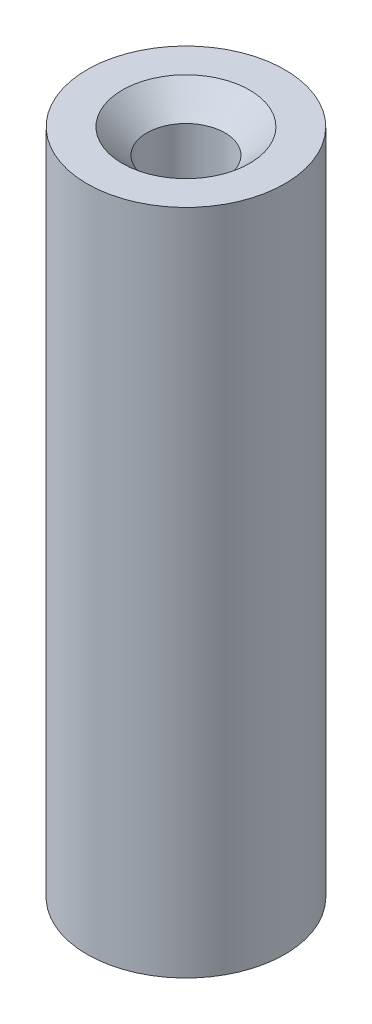
ISO-10303-21;
HEADER;
FILE_DESCRIPTION(('STEP AP214'),'2;1');
FILE_NAME('part.step','',(''),(''),'','','');
FILE_SCHEMA(('AUTOMOTIVE_DESIGN { 1 0 10303 214 1 1 1 1 }'));
ENDSEC;
DATA;
#1=APPLICATION_CONTEXT('core data for automotive mechanical design processes');
#2=APPLICATION_PROTOCOL_DEFINITION('international standard','automotive_design',2000,#1);
#3=PRODUCT_CONTEXT('',#1,'mechanical');
#4=PRODUCT('Part','Part','',(#3));
#5=PRODUCT_RELATED_PRODUCT_CATEGORY('part','',(#4));
#6=PRODUCT_DEFINITION_FORMATION('','',#4);
#7=PRODUCT_DEFINITION_CONTEXT('part definition',#1,'design');
#8=PRODUCT_DEFINITION('design','',#6,#7);
#9=PRODUCT_DEFINITION_SHAPE('','',#8);
#10=(LENGTH_UNIT() NAMED_UNIT(*) SI_UNIT(.MILLI.,.METRE.));
#11=(NAMED_UNIT(*) PLANE_ANGLE_UNIT() SI_UNIT($,.RADIAN.));
#12=(NAMED_UNIT(*) SI_UNIT($,.STERADIAN.) SOLID_ANGLE_UNIT());
#13=UNCERTAINTY_MEASURE_WITH_UNIT(LENGTH_MEASURE(1.E-05),#10,'distance_accuracy_value','');
#14=(GEOMETRIC_REPRESENTATION_CONTEXT(3) GLOBAL_UNCERTAINTY_ASSIGNED_CONTEXT((#13)) GLOBAL_UNIT_ASSIGNED_CONTEXT((#10,
#11,#12)) REPRESENTATION_CONTEXT('',''));
#15=CARTESIAN_POINT('',(0.,0.,0.));
#16=DIRECTION('',(0.,0.,1.));
#17=DIRECTION('',(1.,0.,0.));
#18=AXIS2_PLACEMENT_3D('',#15,#16,#17);
#19=CARTESIAN_POINT('',(0.,27.,0.));
#20=DIRECTION('',(0.,1.,0.));
#21=DIRECTION('',(0.,0.,1.));
#22=AXIS2_PLACEMENT_3D('',#19,#20,#21);
#23=PLANE('',#22);
#24=CARTESIAN_POINT('',(0.,27.,0.));
#25=DIRECTION('',(0.,1.,0.));
#26=DIRECTION('',(0.,0.,1.));
#27=AXIS2_PLACEMENT_3D('',#24,#25,#26);
#28=CIRCLE('',#27,2.575);
#29=CARTESIAN_POINT('',(0.,27.,2.575));
#30=VERTEX_POINT('',#29);
#31=EDGE_CURVE('E10',#30,#30,#28,.F.);
#32=ORIENTED_EDGE('',*,*,#31,.T.);
#33=EDGE_LOOP('',(#32));
#34=FACE_BOUND('',#33,.T.);
#35=CARTESIAN_POINT('',(0.,27.,0.));
#36=DIRECTION('',(0.,1.,0.));
#37=DIRECTION('',(0.,0.,1.));
#38=AXIS2_PLACEMENT_3D('',#35,#36,#37);
#39=CIRCLE('',#38,4.);
#40=CARTESIAN_POINT('',(0.,27.,4.));
#41=VERTEX_POINT('',#40);
#42=EDGE_CURVE('E62',#41,#41,#39,.T.);
#43=ORIENTED_EDGE('',*,*,#42,.T.);
#44=EDGE_LOOP('',(#43));
#45=FACE_BOUND('',#44,.T.);
#46=ADVANCED_FACE('F41',(#34,#45),#23,.T.);
#47=CARTESIAN_POINT('',(0.,0.,0.));
#48=DIRECTION('',(0.,1.,0.));
#49=DIRECTION('',(0.,0.,1.));
#50=AXIS2_PLACEMENT_3D('',#47,#48,#49);
#51=PLANE('',#50);
#52=CARTESIAN_POINT('',(0.,0.,0.));
#53=DIRECTION('',(0.,1.,0.));
#54=DIRECTION('',(0.,0.,1.));
#55=AXIS2_PLACEMENT_3D('',#52,#53,#54);
#56=CIRCLE('',#55,2.575);
#57=CARTESIAN_POINT('',(0.,0.,2.575));
#58=VERTEX_POINT('',#57);
#59=EDGE_CURVE('E60',#58,#58,#56,.T.);
#60=ORIENTED_EDGE('',*,*,#59,.T.);
#61=EDGE_LOOP('',(#60));
#62=FACE_BOUND('',#61,.T.);
#63=CARTESIAN_POINT('',(0.,0.,0.));
#64=DIRECTION('',(0.,1.,0.));
#65=DIRECTION('',(0.,0.,1.));
#66=AXIS2_PLACEMENT_3D('',#63,#64,#65);
#67=CIRCLE('',#66,4.);
#68=CARTESIAN_POINT('',(0.,0.,4.));
#69=VERTEX_POINT('',#68);
#70=EDGE_CURVE('E64',#69,#69,#67,.T.);
#71=ORIENTED_EDGE('',*,*,#70,.F.);
#72=EDGE_LOOP('',(#71));
#73=FACE_BOUND('',#72,.T.);
#74=ADVANCED_FACE('F74',(#62,#73),#51,.F.);
#75=CARTESIAN_POINT('',(0.,27.,0.));
#76=DIRECTION('',(0.,-1.,0.));
#77=DIRECTION('',(0.,0.,-1.));
#78=AXIS2_PLACEMENT_3D('',#75,#76,#77);
#79=CYLINDRICAL_SURFACE('',#78,4.);
#80=ORIENTED_EDGE('',*,*,#42,.F.);
#81=EDGE_LOOP('',(#80));
#82=FACE_BOUND('',#81,.T.);
#83=ORIENTED_EDGE('',*,*,#70,.T.);
#84=EDGE_LOOP('',(#83));
#85=FACE_BOUND('',#84,.T.);
#86=ADVANCED_FACE('F70',(#82,#85),#79,.T.);
#87=CARTESIAN_POINT('',(0.,27.,0.));
#88=DIRECTION('',(0.,-1.,0.));
#89=DIRECTION('',(0.,0.,-1.));
#90=AXIS2_PLACEMENT_3D('',#87,#88,#89);
#91=CYLINDRICAL_SURFACE('',#90,1.575);
#92=CARTESIAN_POINT('',(0.,1.,0.));
#93=DIRECTION('',(0.,1.,0.));
#94=DIRECTION('',(0.,0.,1.));
#95=AXIS2_PLACEMENT_3D('',#92,#93,#94);
#96=CIRCLE('',#95,1.575);
#97=CARTESIAN_POINT('',(0.,1.,1.575));
#98=VERTEX_POINT('',#97);
#99=EDGE_CURVE('E47',#98,#98,#96,.F.);
#100=ORIENTED_EDGE('',*,*,#99,.T.);
#101=EDGE_LOOP('',(#100));
#102=FACE_BOUND('',#101,.T.);
#103=CARTESIAN_POINT('',(0.,26.,0.));
#104=DIRECTION('',(0.,1.,0.));
#105=DIRECTION('',(0.,0.,1.));
#106=AXIS2_PLACEMENT_3D('',#103,#104,#105);
#107=CIRCLE('',#106,1.575);
#108=CARTESIAN_POINT('',(0.,26.,1.575));
#109=VERTEX_POINT('',#108);
#110=EDGE_CURVE('E52',#109,#109,#107,.T.);
#111=ORIENTED_EDGE('',*,*,#110,.T.);
#112=EDGE_LOOP('',(#111));
#113=FACE_BOUND('',#112,.T.);
#114=ADVANCED_FACE('F71',(#102,#113),#91,.F.);
#115=CARTESIAN_POINT('',(0.,0.,0.));
#116=DIRECTION('',(0.,-1.,0.));
#117=DIRECTION('',(0.,0.,-1.));
#118=AXIS2_PLACEMENT_3D('',#115,#116,#117);
#119=CONICAL_SURFACE('',#118,2.575,0.785398163397448);
#120=ORIENTED_EDGE('',*,*,#99,.F.);
#121=EDGE_LOOP('',(#120));
#122=FACE_BOUND('',#121,.T.);
#123=ORIENTED_EDGE('',*,*,#59,.F.);
#124=EDGE_LOOP('',(#123));
#125=FACE_BOUND('',#124,.T.);
#126=ADVANCED_FACE('F86',(#122,#125),#119,.F.);
#127=CARTESIAN_POINT('',(0.,26.,0.));
#128=DIRECTION('',(0.,1.,0.));
#129=DIRECTION('',(0.,0.,1.));
#130=AXIS2_PLACEMENT_3D('',#127,#128,#129);
#131=CONICAL_SURFACE('',#130,1.575,0.78539816339745);
#132=ORIENTED_EDGE('',*,*,#31,.F.);
#133=EDGE_LOOP('',(#132));
#134=FACE_BOUND('',#133,.T.);
#135=ORIENTED_EDGE('',*,*,#110,.F.);
#136=EDGE_LOOP('',(#135));
#137=FACE_BOUND('',#136,.T.);
#138=ADVANCED_FACE('F42',(#134,#137),#131,.F.);
#139=CLOSED_SHELL('',(#46,#74,#86,#114,#126,#138));
#140=MANIFOLD_SOLID_BREP('B2',#139);
#141=ADVANCED_BREP_SHAPE_REPRESENTATION('',(#18,#140),#14);
#142=SHAPE_DEFINITION_REPRESENTATION(#9,#141);
ENDSEC;
END-ISO-10303-21;
